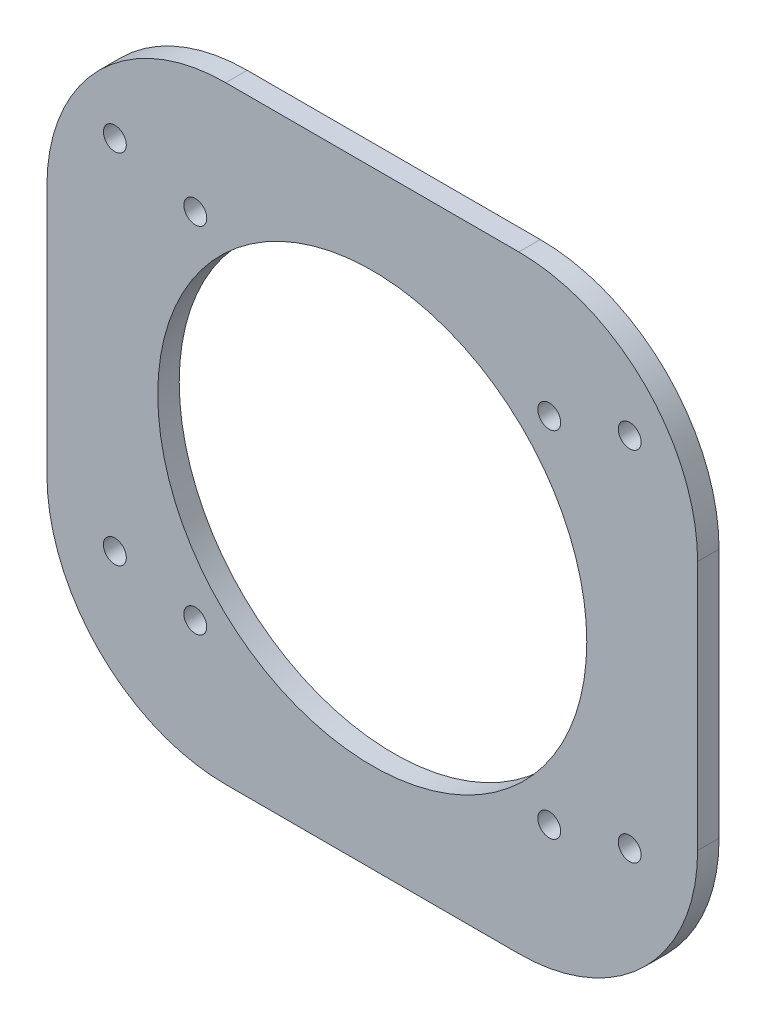
ISO-10303-21;
HEADER;
FILE_DESCRIPTION(('STEP AP214'),'2;1');
FILE_NAME('part.step','',(''),(''),'','','');
FILE_SCHEMA(('AUTOMOTIVE_DESIGN { 1 0 10303 214 1 1 1 1 }'));
ENDSEC;
DATA;
#1=APPLICATION_CONTEXT('core data for automotive mechanical design processes');
#2=APPLICATION_PROTOCOL_DEFINITION('international standard','automotive_design',2000,#1);
#3=PRODUCT_CONTEXT('',#1,'mechanical');
#4=PRODUCT('Part','Part','',(#3));
#5=PRODUCT_RELATED_PRODUCT_CATEGORY('part','',(#4));
#6=PRODUCT_DEFINITION_FORMATION('','',#4);
#7=PRODUCT_DEFINITION_CONTEXT('part definition',#1,'design');
#8=PRODUCT_DEFINITION('design','',#6,#7);
#9=PRODUCT_DEFINITION_SHAPE('','',#8);
#10=(LENGTH_UNIT() NAMED_UNIT(*) SI_UNIT(.MILLI.,.METRE.));
#11=(NAMED_UNIT(*) PLANE_ANGLE_UNIT() SI_UNIT($,.RADIAN.));
#12=(NAMED_UNIT(*) SI_UNIT($,.STERADIAN.) SOLID_ANGLE_UNIT());
#13=UNCERTAINTY_MEASURE_WITH_UNIT(LENGTH_MEASURE(1.E-05),#10,'distance_accuracy_value','');
#14=(GEOMETRIC_REPRESENTATION_CONTEXT(3) GLOBAL_UNCERTAINTY_ASSIGNED_CONTEXT((#13)) GLOBAL_UNIT_ASSIGNED_CONTEXT((#10,
#11,#12)) REPRESENTATION_CONTEXT('',''));
#15=CARTESIAN_POINT('',(0.,0.,0.));
#16=DIRECTION('',(0.,0.,1.));
#17=DIRECTION('',(1.,0.,0.));
#18=AXIS2_PLACEMENT_3D('',#15,#16,#17);
#19=CARTESIAN_POINT('',(0.,0.,3.));
#20=DIRECTION('',(0.,0.,1.));
#21=DIRECTION('',(1.,0.,0.));
#22=AXIS2_PLACEMENT_3D('',#19,#20,#21);
#23=PLANE('',#22);
#24=DIRECTION('',(1.,0.,0.));
#25=VECTOR('',#24,1.);
#26=CARTESIAN_POINT('',(-45.5,-45.5,3.));
#27=LINE('',#26,#25);
#28=CARTESIAN_POINT('',(-20.5,-45.5,3.));
#29=VERTEX_POINT('',#28);
#30=CARTESIAN_POINT('',(20.5,-45.5,3.));
#31=VERTEX_POINT('',#30);
#32=EDGE_CURVE('E113',#29,#31,#27,.T.);
#33=ORIENTED_EDGE('',*,*,#32,.T.);
#34=CARTESIAN_POINT('',(20.5,-20.5,3.));
#35=DIRECTION('',(0.,0.,1.));
#36=DIRECTION('',(1.,0.,0.));
#37=AXIS2_PLACEMENT_3D('',#34,#35,#36);
#38=CIRCLE('',#37,25.);
#39=CARTESIAN_POINT('',(45.5,-20.5,3.));
#40=VERTEX_POINT('',#39);
#41=EDGE_CURVE('E153',#31,#40,#38,.T.);
#42=ORIENTED_EDGE('',*,*,#41,.T.);
#43=DIRECTION('',(0.,1.,0.));
#44=VECTOR('',#43,1.);
#45=CARTESIAN_POINT('',(45.5,37.,3.));
#46=LINE('',#45,#44);
#47=CARTESIAN_POINT('',(45.5,14.5,3.));
#48=VERTEX_POINT('',#47);
#49=EDGE_CURVE('E142',#40,#48,#46,.T.);
#50=ORIENTED_EDGE('',*,*,#49,.T.);
#51=CARTESIAN_POINT('',(20.5,14.5,3.));
#52=DIRECTION('',(0.,0.,1.));
#53=DIRECTION('',(1.,0.,0.));
#54=AXIS2_PLACEMENT_3D('',#51,#52,#53);
#55=CIRCLE('',#54,25.);
#56=CARTESIAN_POINT('',(20.5,39.5,3.));
#57=VERTEX_POINT('',#56);
#58=EDGE_CURVE('E150',#48,#57,#55,.T.);
#59=ORIENTED_EDGE('',*,*,#58,.T.);
#60=DIRECTION('',(1.,0.,0.));
#61=VECTOR('',#60,1.);
#62=CARTESIAN_POINT('',(-45.5,39.5,3.));
#63=LINE('',#62,#61);
#64=CARTESIAN_POINT('',(-20.5,39.5,3.));
#65=VERTEX_POINT('',#64);
#66=EDGE_CURVE('E295',#65,#57,#63,.T.);
#67=ORIENTED_EDGE('',*,*,#66,.F.);
#68=CARTESIAN_POINT('',(-20.5,14.5,3.));
#69=DIRECTION('',(0.,0.,1.));
#70=DIRECTION('',(1.,0.,0.));
#71=AXIS2_PLACEMENT_3D('',#68,#69,#70);
#72=CIRCLE('',#71,25.);
#73=CARTESIAN_POINT('',(-45.5,14.5,3.));
#74=VERTEX_POINT('',#73);
#75=EDGE_CURVE('E121',#65,#74,#72,.T.);
#76=ORIENTED_EDGE('',*,*,#75,.T.);
#77=DIRECTION('',(0.,-1.,0.));
#78=VECTOR('',#77,1.);
#79=CARTESIAN_POINT('',(-45.5,37.,3.));
#80=LINE('',#79,#78);
#81=CARTESIAN_POINT('',(-45.5,-20.5,3.));
#82=VERTEX_POINT('',#81);
#83=EDGE_CURVE('E115',#74,#82,#80,.T.);
#84=ORIENTED_EDGE('',*,*,#83,.T.);
#85=CARTESIAN_POINT('',(-20.5,-20.5,3.));
#86=DIRECTION('',(0.,0.,1.));
#87=DIRECTION('',(1.,0.,0.));
#88=AXIS2_PLACEMENT_3D('',#85,#86,#87);
#89=CIRCLE('',#88,25.);
#90=EDGE_CURVE('E110',#82,#29,#89,.T.);
#91=ORIENTED_EDGE('',*,*,#90,.T.);
#92=EDGE_LOOP('',(#33,#42,#50,#59,#67,#76,#84,#91));
#93=FACE_BOUND('',#92,.T.);
#94=CARTESIAN_POINT('',(-24.7487373415292,21.7487373415292,3.));
#95=DIRECTION('',(0.,0.,1.));
#96=DIRECTION('',(-1.,0.,0.));
#97=AXIS2_PLACEMENT_3D('',#94,#95,#96);
#98=CIRCLE('',#97,1.6);
#99=CARTESIAN_POINT('',(-26.3487373415292,21.7487373415292,3.));
#100=VERTEX_POINT('',#99);
#101=EDGE_CURVE('E302',#100,#100,#98,.T.);
#102=ORIENTED_EDGE('',*,*,#101,.F.);
#103=EDGE_LOOP('',(#102));
#104=FACE_BOUND('',#103,.T.);
#105=CARTESIAN_POINT('',(-24.7487373415292,-27.7487373415292,3.));
#106=DIRECTION('',(0.,0.,1.));
#107=DIRECTION('',(-1.,0.,0.));
#108=AXIS2_PLACEMENT_3D('',#105,#106,#107);
#109=CIRCLE('',#108,1.59999999999998);
#110=CARTESIAN_POINT('',(-26.3487373415292,-27.7487373415292,3.));
#111=VERTEX_POINT('',#110);
#112=EDGE_CURVE('E312',#111,#111,#109,.T.);
#113=ORIENTED_EDGE('',*,*,#112,.F.);
#114=EDGE_LOOP('',(#113));
#115=FACE_BOUND('',#114,.T.);
#116=CARTESIAN_POINT('',(24.7487373415292,21.7487373415292,3.));
#117=DIRECTION('',(0.,0.,1.));
#118=DIRECTION('',(1.,0.,0.));
#119=AXIS2_PLACEMENT_3D('',#116,#117,#118);
#120=CIRCLE('',#119,1.6);
#121=CARTESIAN_POINT('',(26.3487373415292,21.7487373415292,3.));
#122=VERTEX_POINT('',#121);
#123=EDGE_CURVE('E308',#122,#122,#120,.T.);
#124=ORIENTED_EDGE('',*,*,#123,.F.);
#125=EDGE_LOOP('',(#124));
#126=FACE_BOUND('',#125,.T.);
#127=CARTESIAN_POINT('',(24.7487373415292,-27.7487373415292,3.));
#128=DIRECTION('',(0.,0.,1.));
#129=DIRECTION('',(1.,0.,0.));
#130=AXIS2_PLACEMENT_3D('',#127,#128,#129);
#131=CIRCLE('',#130,1.6);
#132=CARTESIAN_POINT('',(26.3487373415292,-27.7487373415292,3.));
#133=VERTEX_POINT('',#132);
#134=EDGE_CURVE('E304',#133,#133,#131,.T.);
#135=ORIENTED_EDGE('',*,*,#134,.F.);
#136=EDGE_LOOP('',(#135));
#137=FACE_BOUND('',#136,.T.);
#138=CARTESIAN_POINT('',(0.,-3.,3.));
#139=DIRECTION('',(0.,0.,1.));
#140=DIRECTION('',(1.,0.,0.));
#141=AXIS2_PLACEMENT_3D('',#138,#139,#140);
#142=CIRCLE('',#141,30.);
#143=CARTESIAN_POINT('',(30.,-3.,3.));
#144=VERTEX_POINT('',#143);
#145=EDGE_CURVE('E200',#144,#144,#142,.T.);
#146=ORIENTED_EDGE('',*,*,#145,.F.);
#147=EDGE_LOOP('',(#146));
#148=FACE_BOUND('',#147,.T.);
#149=CARTESIAN_POINT('',(-36.,25.,3.));
#150=DIRECTION('',(0.,0.,1.));
#151=DIRECTION('',(-1.,0.,0.));
#152=AXIS2_PLACEMENT_3D('',#149,#150,#151);
#153=CIRCLE('',#152,1.59999999999999);
#154=CARTESIAN_POINT('',(-37.6,25.,3.));
#155=VERTEX_POINT('',#154);
#156=EDGE_CURVE('E229',#155,#155,#153,.T.);
#157=ORIENTED_EDGE('',*,*,#156,.F.);
#158=EDGE_LOOP('',(#157));
#159=FACE_BOUND('',#158,.T.);
#160=CARTESIAN_POINT('',(36.,-25.,3.));
#161=DIRECTION('',(0.,0.,1.));
#162=DIRECTION('',(1.,0.,0.));
#163=AXIS2_PLACEMENT_3D('',#160,#161,#162);
#164=CIRCLE('',#163,1.6);
#165=CARTESIAN_POINT('',(37.6,-25.,3.));
#166=VERTEX_POINT('',#165);
#167=EDGE_CURVE('E192',#166,#166,#164,.T.);
#168=ORIENTED_EDGE('',*,*,#167,.F.);
#169=EDGE_LOOP('',(#168));
#170=FACE_BOUND('',#169,.T.);
#171=CARTESIAN_POINT('',(36.,25.,3.));
#172=DIRECTION('',(0.,0.,1.));
#173=DIRECTION('',(1.,0.,0.));
#174=AXIS2_PLACEMENT_3D('',#171,#172,#173);
#175=CIRCLE('',#174,1.6);
#176=CARTESIAN_POINT('',(37.6,25.,3.));
#177=VERTEX_POINT('',#176);
#178=EDGE_CURVE('E237',#177,#177,#175,.T.);
#179=ORIENTED_EDGE('',*,*,#178,.F.);
#180=EDGE_LOOP('',(#179));
#181=FACE_BOUND('',#180,.T.);
#182=CARTESIAN_POINT('',(-36.,-25.,3.));
#183=DIRECTION('',(0.,0.,1.));
#184=DIRECTION('',(-1.,0.,0.));
#185=AXIS2_PLACEMENT_3D('',#182,#183,#184);
#186=CIRCLE('',#185,1.59999999999999);
#187=CARTESIAN_POINT('',(-37.6,-25.,3.));
#188=VERTEX_POINT('',#187);
#189=EDGE_CURVE('E219',#188,#188,#186,.T.);
#190=ORIENTED_EDGE('',*,*,#189,.F.);
#191=EDGE_LOOP('',(#190));
#192=FACE_BOUND('',#191,.T.);
#193=ADVANCED_FACE('F43',(#93,#104,#115,#126,#137,#148,#159,#170,#181,#192),#23,.T.);
#194=CARTESIAN_POINT('',(0.,0.,0.));
#195=DIRECTION('',(0.,0.,1.));
#196=DIRECTION('',(1.,0.,0.));
#197=AXIS2_PLACEMENT_3D('',#194,#195,#196);
#198=PLANE('',#197);
#199=CARTESIAN_POINT('',(-24.7487373415292,21.7487373415292,0.));
#200=DIRECTION('',(0.,0.,1.));
#201=DIRECTION('',(1.,0.,0.));
#202=AXIS2_PLACEMENT_3D('',#199,#200,#201);
#203=CIRCLE('',#202,1.6);
#204=CARTESIAN_POINT('',(-23.1487373415292,21.7487373415292,0.));
#205=VERTEX_POINT('',#204);
#206=EDGE_CURVE('E145',#205,#205,#203,.T.);
#207=ORIENTED_EDGE('',*,*,#206,.T.);
#208=EDGE_LOOP('',(#207));
#209=FACE_BOUND('',#208,.T.);
#210=CARTESIAN_POINT('',(-24.7487373415292,-27.7487373415292,0.));
#211=DIRECTION('',(0.,0.,1.));
#212=DIRECTION('',(1.,0.,0.));
#213=AXIS2_PLACEMENT_3D('',#210,#211,#212);
#214=CIRCLE('',#213,1.59999999999998);
#215=CARTESIAN_POINT('',(-23.1487373415292,-27.7487373415292,0.));
#216=VERTEX_POINT('',#215);
#217=EDGE_CURVE('E207',#216,#216,#214,.T.);
#218=ORIENTED_EDGE('',*,*,#217,.T.);
#219=EDGE_LOOP('',(#218));
#220=FACE_BOUND('',#219,.T.);
#221=CARTESIAN_POINT('',(24.7487373415292,21.7487373415292,0.));
#222=DIRECTION('',(0.,0.,1.));
#223=DIRECTION('',(1.,0.,0.));
#224=AXIS2_PLACEMENT_3D('',#221,#222,#223);
#225=CIRCLE('',#224,1.6);
#226=CARTESIAN_POINT('',(26.3487373415292,21.7487373415292,0.));
#227=VERTEX_POINT('',#226);
#228=EDGE_CURVE('E204',#227,#227,#225,.T.);
#229=ORIENTED_EDGE('',*,*,#228,.T.);
#230=EDGE_LOOP('',(#229));
#231=FACE_BOUND('',#230,.T.);
#232=CARTESIAN_POINT('',(24.7487373415292,-27.7487373415292,0.));
#233=DIRECTION('',(0.,0.,1.));
#234=DIRECTION('',(1.,0.,0.));
#235=AXIS2_PLACEMENT_3D('',#232,#233,#234);
#236=CIRCLE('',#235,1.6);
#237=CARTESIAN_POINT('',(26.3487373415292,-27.7487373415292,0.));
#238=VERTEX_POINT('',#237);
#239=EDGE_CURVE('E199',#238,#238,#236,.T.);
#240=ORIENTED_EDGE('',*,*,#239,.T.);
#241=EDGE_LOOP('',(#240));
#242=FACE_BOUND('',#241,.T.);
#243=CARTESIAN_POINT('',(0.,-3.,0.));
#244=DIRECTION('',(0.,0.,1.));
#245=DIRECTION('',(1.,0.,0.));
#246=AXIS2_PLACEMENT_3D('',#243,#244,#245);
#247=CIRCLE('',#246,30.);
#248=CARTESIAN_POINT('',(30.,-3.,0.));
#249=VERTEX_POINT('',#248);
#250=EDGE_CURVE('E195',#249,#249,#247,.T.);
#251=ORIENTED_EDGE('',*,*,#250,.T.);
#252=EDGE_LOOP('',(#251));
#253=FACE_BOUND('',#252,.T.);
#254=DIRECTION('',(0.,1.,0.));
#255=VECTOR('',#254,1.);
#256=CARTESIAN_POINT('',(45.5,37.,0.));
#257=LINE('',#256,#255);
#258=CARTESIAN_POINT('',(45.5,-20.5,0.));
#259=VERTEX_POINT('',#258);
#260=CARTESIAN_POINT('',(45.5,14.5,0.));
#261=VERTEX_POINT('',#260);
#262=EDGE_CURVE('E185',#259,#261,#257,.T.);
#263=ORIENTED_EDGE('',*,*,#262,.F.);
#264=CARTESIAN_POINT('',(20.5,-20.5,0.));
#265=DIRECTION('',(0.,0.,1.));
#266=DIRECTION('',(1.,0.,0.));
#267=AXIS2_PLACEMENT_3D('',#264,#265,#266);
#268=CIRCLE('',#267,25.);
#269=CARTESIAN_POINT('',(20.5,-45.5,0.));
#270=VERTEX_POINT('',#269);
#271=EDGE_CURVE('E170',#259,#270,#268,.F.);
#272=ORIENTED_EDGE('',*,*,#271,.T.);
#273=DIRECTION('',(1.,0.,0.));
#274=VECTOR('',#273,1.);
#275=CARTESIAN_POINT('',(-45.5,-45.5,0.));
#276=LINE('',#275,#274);
#277=CARTESIAN_POINT('',(-20.5,-45.5,0.));
#278=VERTEX_POINT('',#277);
#279=EDGE_CURVE('E132',#278,#270,#276,.T.);
#280=ORIENTED_EDGE('',*,*,#279,.F.);
#281=CARTESIAN_POINT('',(-20.5,-20.5,0.));
#282=DIRECTION('',(0.,0.,1.));
#283=DIRECTION('',(1.,0.,0.));
#284=AXIS2_PLACEMENT_3D('',#281,#282,#283);
#285=CIRCLE('',#284,25.);
#286=CARTESIAN_POINT('',(-45.5,-20.5,0.));
#287=VERTEX_POINT('',#286);
#288=EDGE_CURVE('E136',#278,#287,#285,.F.);
#289=ORIENTED_EDGE('',*,*,#288,.T.);
#290=DIRECTION('',(0.,-1.,0.));
#291=VECTOR('',#290,1.);
#292=CARTESIAN_POINT('',(-45.5,37.,0.));
#293=LINE('',#292,#291);
#294=CARTESIAN_POINT('',(-45.5,14.5,0.));
#295=VERTEX_POINT('',#294);
#296=EDGE_CURVE('E183',#295,#287,#293,.T.);
#297=ORIENTED_EDGE('',*,*,#296,.F.);
#298=CARTESIAN_POINT('',(-20.5,14.5,0.));
#299=DIRECTION('',(0.,0.,1.));
#300=DIRECTION('',(1.,0.,0.));
#301=AXIS2_PLACEMENT_3D('',#298,#299,#300);
#302=CIRCLE('',#301,25.);
#303=CARTESIAN_POINT('',(-20.5,39.5,0.));
#304=VERTEX_POINT('',#303);
#305=EDGE_CURVE('E66',#295,#304,#302,.F.);
#306=ORIENTED_EDGE('',*,*,#305,.T.);
#307=DIRECTION('',(1.,0.,0.));
#308=VECTOR('',#307,1.);
#309=CARTESIAN_POINT('',(-45.5,39.5,0.));
#310=LINE('',#309,#308);
#311=CARTESIAN_POINT('',(20.5,39.5,0.));
#312=VERTEX_POINT('',#311);
#313=EDGE_CURVE('E133',#304,#312,#310,.T.);
#314=ORIENTED_EDGE('',*,*,#313,.T.);
#315=CARTESIAN_POINT('',(20.5,14.5,0.));
#316=DIRECTION('',(0.,0.,1.));
#317=DIRECTION('',(1.,0.,0.));
#318=AXIS2_PLACEMENT_3D('',#315,#316,#317);
#319=CIRCLE('',#318,25.);
#320=EDGE_CURVE('E167',#312,#261,#319,.F.);
#321=ORIENTED_EDGE('',*,*,#320,.T.);
#322=EDGE_LOOP('',(#263,#272,#280,#289,#297,#306,#314,#321));
#323=FACE_BOUND('',#322,.T.);
#324=CARTESIAN_POINT('',(36.,-25.,0.));
#325=DIRECTION('',(0.,0.,1.));
#326=DIRECTION('',(1.,0.,0.));
#327=AXIS2_PLACEMENT_3D('',#324,#325,#326);
#328=CIRCLE('',#327,1.6);
#329=CARTESIAN_POINT('',(37.6,-25.,0.));
#330=VERTEX_POINT('',#329);
#331=EDGE_CURVE('E241',#330,#330,#328,.T.);
#332=ORIENTED_EDGE('',*,*,#331,.T.);
#333=EDGE_LOOP('',(#332));
#334=FACE_BOUND('',#333,.T.);
#335=CARTESIAN_POINT('',(36.,25.,0.));
#336=DIRECTION('',(0.,0.,1.));
#337=DIRECTION('',(1.,0.,0.));
#338=AXIS2_PLACEMENT_3D('',#335,#336,#337);
#339=CIRCLE('',#338,1.6);
#340=CARTESIAN_POINT('',(37.6,25.,0.));
#341=VERTEX_POINT('',#340);
#342=EDGE_CURVE('E233',#341,#341,#339,.T.);
#343=ORIENTED_EDGE('',*,*,#342,.T.);
#344=EDGE_LOOP('',(#343));
#345=FACE_BOUND('',#344,.T.);
#346=CARTESIAN_POINT('',(-36.,25.,0.));
#347=DIRECTION('',(0.,0.,1.));
#348=DIRECTION('',(-1.,0.,0.));
#349=AXIS2_PLACEMENT_3D('',#346,#347,#348);
#350=CIRCLE('',#349,1.59999999999999);
#351=CARTESIAN_POINT('',(-37.6,25.,0.));
#352=VERTEX_POINT('',#351);
#353=EDGE_CURVE('E225',#352,#352,#350,.T.);
#354=ORIENTED_EDGE('',*,*,#353,.T.);
#355=EDGE_LOOP('',(#354));
#356=FACE_BOUND('',#355,.T.);
#357=CARTESIAN_POINT('',(-36.,-25.,0.));
#358=DIRECTION('',(0.,0.,1.));
#359=DIRECTION('',(-1.,0.,0.));
#360=AXIS2_PLACEMENT_3D('',#357,#358,#359);
#361=CIRCLE('',#360,1.59999999999999);
#362=CARTESIAN_POINT('',(-37.6,-25.,0.));
#363=VERTEX_POINT('',#362);
#364=EDGE_CURVE('E214',#363,#363,#361,.T.);
#365=ORIENTED_EDGE('',*,*,#364,.T.);
#366=EDGE_LOOP('',(#365));
#367=FACE_BOUND('',#366,.T.);
#368=ADVANCED_FACE('F252',(#209,#220,#231,#242,#253,#323,#334,#345,#356,#367),#198,.F.);
#369=CARTESIAN_POINT('',(45.5,37.,3.));
#370=DIRECTION('',(-1.,0.,0.));
#371=DIRECTION('',(0.,-1.,0.));
#372=AXIS2_PLACEMENT_3D('',#369,#370,#371);
#373=PLANE('',#372);
#374=ORIENTED_EDGE('',*,*,#49,.F.);
#375=DIRECTION('',(0.,0.,1.));
#376=VECTOR('',#375,1.);
#377=CARTESIAN_POINT('',(45.5,-20.5,0.));
#378=LINE('',#377,#376);
#379=EDGE_CURVE('E160',#40,#259,#378,.F.);
#380=ORIENTED_EDGE('',*,*,#379,.T.);
#381=ORIENTED_EDGE('',*,*,#262,.T.);
#382=DIRECTION('',(0.,0.,1.));
#383=VECTOR('',#382,1.);
#384=CARTESIAN_POINT('',(45.5,14.5,3.));
#385=LINE('',#384,#383);
#386=EDGE_CURVE('E156',#261,#48,#385,.T.);
#387=ORIENTED_EDGE('',*,*,#386,.T.);
#388=EDGE_LOOP('',(#374,#380,#381,#387));
#389=FACE_BOUND('',#388,.T.);
#390=ADVANCED_FACE('F267',(#389),#373,.F.);
#391=CARTESIAN_POINT('',(-45.5,37.,3.));
#392=DIRECTION('',(1.,0.,0.));
#393=DIRECTION('',(0.,1.,0.));
#394=AXIS2_PLACEMENT_3D('',#391,#392,#393);
#395=PLANE('',#394);
#396=ORIENTED_EDGE('',*,*,#83,.F.);
#397=DIRECTION('',(0.,0.,1.));
#398=VECTOR('',#397,1.);
#399=CARTESIAN_POINT('',(-45.5,14.5,3.));
#400=LINE('',#399,#398);
#401=EDGE_CURVE('E11',#74,#295,#400,.F.);
#402=ORIENTED_EDGE('',*,*,#401,.T.);
#403=ORIENTED_EDGE('',*,*,#296,.T.);
#404=DIRECTION('',(0.,0.,1.));
#405=VECTOR('',#404,1.);
#406=CARTESIAN_POINT('',(-45.5,-20.5,3.));
#407=LINE('',#406,#405);
#408=EDGE_CURVE('E52',#287,#82,#407,.T.);
#409=ORIENTED_EDGE('',*,*,#408,.T.);
#410=EDGE_LOOP('',(#396,#402,#403,#409));
#411=FACE_BOUND('',#410,.T.);
#412=ADVANCED_FACE('F181',(#411),#395,.F.);
#413=CARTESIAN_POINT('',(36.,-25.,3.));
#414=DIRECTION('',(0.,0.,-1.));
#415=DIRECTION('',(-1.,0.,0.));
#416=AXIS2_PLACEMENT_3D('',#413,#414,#415);
#417=CYLINDRICAL_SURFACE('',#416,1.6);
#418=ORIENTED_EDGE('',*,*,#167,.T.);
#419=EDGE_LOOP('',(#418));
#420=FACE_BOUND('',#419,.T.);
#421=ORIENTED_EDGE('',*,*,#331,.F.);
#422=EDGE_LOOP('',(#421));
#423=FACE_BOUND('',#422,.T.);
#424=ADVANCED_FACE('F255',(#420,#423),#417,.F.);
#425=CARTESIAN_POINT('',(36.,25.,3.));
#426=DIRECTION('',(0.,0.,-1.));
#427=DIRECTION('',(-1.,0.,0.));
#428=AXIS2_PLACEMENT_3D('',#425,#426,#427);
#429=CYLINDRICAL_SURFACE('',#428,1.6);
#430=ORIENTED_EDGE('',*,*,#178,.T.);
#431=EDGE_LOOP('',(#430));
#432=FACE_BOUND('',#431,.T.);
#433=ORIENTED_EDGE('',*,*,#342,.F.);
#434=EDGE_LOOP('',(#433));
#435=FACE_BOUND('',#434,.T.);
#436=ADVANCED_FACE('F257',(#432,#435),#429,.F.);
#437=CARTESIAN_POINT('',(-36.,25.,3.));
#438=DIRECTION('',(0.,0.,-1.));
#439=DIRECTION('',(-1.,0.,0.));
#440=AXIS2_PLACEMENT_3D('',#437,#438,#439);
#441=CYLINDRICAL_SURFACE('',#440,1.59999999999999);
#442=ORIENTED_EDGE('',*,*,#156,.T.);
#443=EDGE_LOOP('',(#442));
#444=FACE_BOUND('',#443,.T.);
#445=ORIENTED_EDGE('',*,*,#353,.F.);
#446=EDGE_LOOP('',(#445));
#447=FACE_BOUND('',#446,.T.);
#448=ADVANCED_FACE('F264',(#444,#447),#441,.F.);
#449=CARTESIAN_POINT('',(-36.,-25.,3.));
#450=DIRECTION('',(0.,0.,-1.));
#451=DIRECTION('',(-1.,0.,0.));
#452=AXIS2_PLACEMENT_3D('',#449,#450,#451);
#453=CYLINDRICAL_SURFACE('',#452,1.59999999999999);
#454=ORIENTED_EDGE('',*,*,#189,.T.);
#455=EDGE_LOOP('',(#454));
#456=FACE_BOUND('',#455,.T.);
#457=ORIENTED_EDGE('',*,*,#364,.F.);
#458=EDGE_LOOP('',(#457));
#459=FACE_BOUND('',#458,.T.);
#460=ADVANCED_FACE('F334',(#456,#459),#453,.F.);
#461=CARTESIAN_POINT('',(0.,-3.,-7.));
#462=DIRECTION('',(0.,0.,1.));
#463=DIRECTION('',(1.,0.,0.));
#464=AXIS2_PLACEMENT_3D('',#461,#462,#463);
#465=CYLINDRICAL_SURFACE('',#464,30.);
#466=ORIENTED_EDGE('',*,*,#145,.T.);
#467=EDGE_LOOP('',(#466));
#468=FACE_BOUND('',#467,.T.);
#469=ORIENTED_EDGE('',*,*,#250,.F.);
#470=EDGE_LOOP('',(#469));
#471=FACE_BOUND('',#470,.T.);
#472=ADVANCED_FACE('F322',(#468,#471),#465,.F.);
#473=CARTESIAN_POINT('',(24.7487373415292,-27.7487373415292,-7.));
#474=DIRECTION('',(0.,0.,1.));
#475=DIRECTION('',(1.,0.,0.));
#476=AXIS2_PLACEMENT_3D('',#473,#474,#475);
#477=CYLINDRICAL_SURFACE('',#476,1.6);
#478=ORIENTED_EDGE('',*,*,#134,.T.);
#479=EDGE_LOOP('',(#478));
#480=FACE_BOUND('',#479,.T.);
#481=ORIENTED_EDGE('',*,*,#239,.F.);
#482=EDGE_LOOP('',(#481));
#483=FACE_BOUND('',#482,.T.);
#484=ADVANCED_FACE('F342',(#480,#483),#477,.F.);
#485=CARTESIAN_POINT('',(24.7487373415292,21.7487373415292,-7.));
#486=DIRECTION('',(0.,0.,1.));
#487=DIRECTION('',(1.,0.,0.));
#488=AXIS2_PLACEMENT_3D('',#485,#486,#487);
#489=CYLINDRICAL_SURFACE('',#488,1.6);
#490=ORIENTED_EDGE('',*,*,#123,.T.);
#491=EDGE_LOOP('',(#490));
#492=FACE_BOUND('',#491,.T.);
#493=ORIENTED_EDGE('',*,*,#228,.F.);
#494=EDGE_LOOP('',(#493));
#495=FACE_BOUND('',#494,.T.);
#496=ADVANCED_FACE('F354',(#492,#495),#489,.F.);
#497=CARTESIAN_POINT('',(-24.7487373415292,-27.7487373415292,-7.));
#498=DIRECTION('',(0.,0.,1.));
#499=DIRECTION('',(1.,0.,0.));
#500=AXIS2_PLACEMENT_3D('',#497,#498,#499);
#501=CYLINDRICAL_SURFACE('',#500,1.59999999999998);
#502=ORIENTED_EDGE('',*,*,#112,.T.);
#503=EDGE_LOOP('',(#502));
#504=FACE_BOUND('',#503,.T.);
#505=ORIENTED_EDGE('',*,*,#217,.F.);
#506=EDGE_LOOP('',(#505));
#507=FACE_BOUND('',#506,.T.);
#508=ADVANCED_FACE('F350',(#504,#507),#501,.F.);
#509=CARTESIAN_POINT('',(-24.7487373415292,21.7487373415292,-7.));
#510=DIRECTION('',(0.,0.,1.));
#511=DIRECTION('',(1.,0.,0.));
#512=AXIS2_PLACEMENT_3D('',#509,#510,#511);
#513=CYLINDRICAL_SURFACE('',#512,1.6);
#514=ORIENTED_EDGE('',*,*,#101,.T.);
#515=EDGE_LOOP('',(#514));
#516=FACE_BOUND('',#515,.T.);
#517=ORIENTED_EDGE('',*,*,#206,.F.);
#518=EDGE_LOOP('',(#517));
#519=FACE_BOUND('',#518,.T.);
#520=ADVANCED_FACE('F347',(#516,#519),#513,.F.);
#521=CARTESIAN_POINT('',(-45.5,-45.5,0.));
#522=DIRECTION('',(0.,-1.,0.));
#523=DIRECTION('',(0.,0.,-1.));
#524=AXIS2_PLACEMENT_3D('',#521,#522,#523);
#525=PLANE('',#524);
#526=ORIENTED_EDGE('',*,*,#279,.T.);
#527=DIRECTION('',(0.,0.,1.));
#528=VECTOR('',#527,1.);
#529=CARTESIAN_POINT('',(20.5,-45.5,3.));
#530=LINE('',#529,#528);
#531=EDGE_CURVE('E122',#270,#31,#530,.T.);
#532=ORIENTED_EDGE('',*,*,#531,.T.);
#533=ORIENTED_EDGE('',*,*,#32,.F.);
#534=DIRECTION('',(0.,0.,1.));
#535=VECTOR('',#534,1.);
#536=CARTESIAN_POINT('',(-20.5,-45.5,0.));
#537=LINE('',#536,#535);
#538=EDGE_CURVE('E128',#29,#278,#537,.F.);
#539=ORIENTED_EDGE('',*,*,#538,.T.);
#540=EDGE_LOOP('',(#526,#532,#533,#539));
#541=FACE_BOUND('',#540,.T.);
#542=ADVANCED_FACE('F127',(#541),#525,.T.);
#543=CARTESIAN_POINT('',(-45.5,39.5,0.));
#544=DIRECTION('',(0.,-1.,0.));
#545=DIRECTION('',(0.,0.,-1.));
#546=AXIS2_PLACEMENT_3D('',#543,#544,#545);
#547=PLANE('',#546);
#548=ORIENTED_EDGE('',*,*,#66,.T.);
#549=DIRECTION('',(0.,0.,1.));
#550=VECTOR('',#549,1.);
#551=CARTESIAN_POINT('',(20.5,39.5,0.));
#552=LINE('',#551,#550);
#553=EDGE_CURVE('E59',#57,#312,#552,.F.);
#554=ORIENTED_EDGE('',*,*,#553,.T.);
#555=ORIENTED_EDGE('',*,*,#313,.F.);
#556=DIRECTION('',(0.,0.,1.));
#557=VECTOR('',#556,1.);
#558=CARTESIAN_POINT('',(-20.5,39.5,0.));
#559=LINE('',#558,#557);
#560=EDGE_CURVE('E173',#304,#65,#559,.T.);
#561=ORIENTED_EDGE('',*,*,#560,.T.);
#562=EDGE_LOOP('',(#548,#554,#555,#561));
#563=FACE_BOUND('',#562,.T.);
#564=ADVANCED_FACE('F283',(#563),#547,.F.);
#565=CARTESIAN_POINT('',(20.5,-20.5,0.));
#566=DIRECTION('',(0.,0.,-1.));
#567=DIRECTION('',(-1.,0.,0.));
#568=AXIS2_PLACEMENT_3D('',#565,#566,#567);
#569=CYLINDRICAL_SURFACE('',#568,25.);
#570=ORIENTED_EDGE('',*,*,#271,.F.);
#571=ORIENTED_EDGE('',*,*,#379,.F.);
#572=ORIENTED_EDGE('',*,*,#41,.F.);
#573=ORIENTED_EDGE('',*,*,#531,.F.);
#574=EDGE_LOOP('',(#570,#571,#572,#573));
#575=FACE_BOUND('',#574,.T.);
#576=ADVANCED_FACE('F279',(#575),#569,.T.);
#577=CARTESIAN_POINT('',(20.5,14.5,3.));
#578=DIRECTION('',(0.,0.,1.));
#579=DIRECTION('',(1.,0.,0.));
#580=AXIS2_PLACEMENT_3D('',#577,#578,#579);
#581=CYLINDRICAL_SURFACE('',#580,25.);
#582=ORIENTED_EDGE('',*,*,#320,.F.);
#583=ORIENTED_EDGE('',*,*,#553,.F.);
#584=ORIENTED_EDGE('',*,*,#58,.F.);
#585=ORIENTED_EDGE('',*,*,#386,.F.);
#586=EDGE_LOOP('',(#582,#583,#584,#585));
#587=FACE_BOUND('',#586,.T.);
#588=ADVANCED_FACE('F282',(#587),#581,.T.);
#589=CARTESIAN_POINT('',(-20.5,14.5,0.));
#590=DIRECTION('',(0.,0.,1.));
#591=DIRECTION('',(1.,0.,0.));
#592=AXIS2_PLACEMENT_3D('',#589,#590,#591);
#593=CYLINDRICAL_SURFACE('',#592,25.);
#594=ORIENTED_EDGE('',*,*,#305,.F.);
#595=ORIENTED_EDGE('',*,*,#401,.F.);
#596=ORIENTED_EDGE('',*,*,#75,.F.);
#597=ORIENTED_EDGE('',*,*,#560,.F.);
#598=EDGE_LOOP('',(#594,#595,#596,#597));
#599=FACE_BOUND('',#598,.T.);
#600=ADVANCED_FACE('F286',(#599),#593,.T.);
#601=CARTESIAN_POINT('',(-20.5,-20.5,3.));
#602=DIRECTION('',(0.,0.,-1.));
#603=DIRECTION('',(-1.,0.,0.));
#604=AXIS2_PLACEMENT_3D('',#601,#602,#603);
#605=CYLINDRICAL_SURFACE('',#604,25.);
#606=ORIENTED_EDGE('',*,*,#288,.F.);
#607=ORIENTED_EDGE('',*,*,#538,.F.);
#608=ORIENTED_EDGE('',*,*,#90,.F.);
#609=ORIENTED_EDGE('',*,*,#408,.F.);
#610=EDGE_LOOP('',(#606,#607,#608,#609));
#611=FACE_BOUND('',#610,.T.);
#612=ADVANCED_FACE('F45',(#611),#605,.T.);
#613=CLOSED_SHELL('',(#193,#368,#390,#412,#424,#436,#448,#460,#472,#484,#496,#508,#520,#542,
#564,#576,#588,#600,#612));
#614=MANIFOLD_SOLID_BREP('B2',#613);
#615=ADVANCED_BREP_SHAPE_REPRESENTATION('',(#18,#614),#14);
#616=SHAPE_DEFINITION_REPRESENTATION(#9,#615);
ENDSEC;
END-ISO-10303-21;
